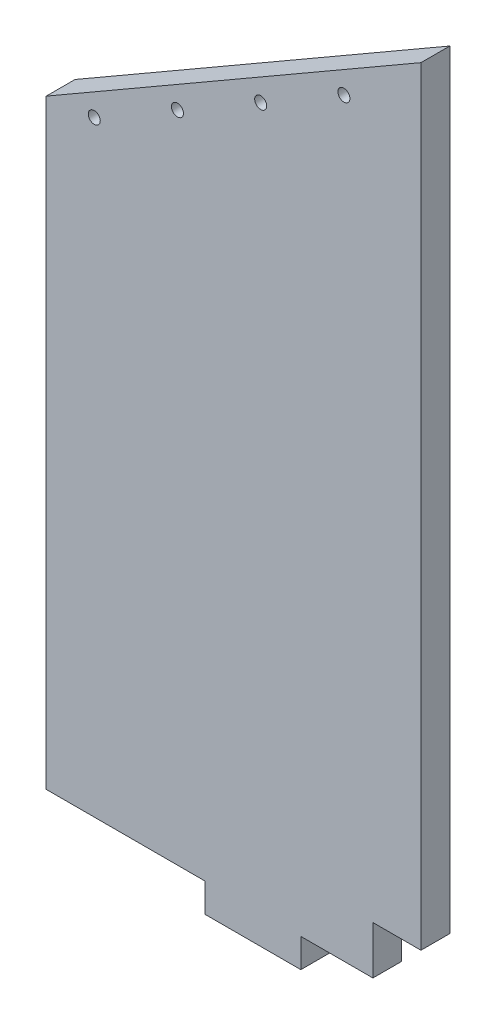
ISO-10303-21;
HEADER;
FILE_DESCRIPTION(('STEP AP214'),'2;1');
FILE_NAME('part.step','',(''),(''),'','','');
FILE_SCHEMA(('AUTOMOTIVE_DESIGN { 1 0 10303 214 1 1 1 1 }'));
ENDSEC;
DATA;
#1=APPLICATION_CONTEXT('core data for automotive mechanical design processes');
#2=APPLICATION_PROTOCOL_DEFINITION('international standard','automotive_design',2000,#1);
#3=PRODUCT_CONTEXT('',#1,'mechanical');
#4=PRODUCT('Part','Part','',(#3));
#5=PRODUCT_RELATED_PRODUCT_CATEGORY('part','',(#4));
#6=PRODUCT_DEFINITION_FORMATION('','',#4);
#7=PRODUCT_DEFINITION_CONTEXT('part definition',#1,'design');
#8=PRODUCT_DEFINITION('design','',#6,#7);
#9=PRODUCT_DEFINITION_SHAPE('','',#8);
#10=(LENGTH_UNIT() NAMED_UNIT(*) SI_UNIT(.MILLI.,.METRE.));
#11=(NAMED_UNIT(*) PLANE_ANGLE_UNIT() SI_UNIT($,.RADIAN.));
#12=(NAMED_UNIT(*) SI_UNIT($,.STERADIAN.) SOLID_ANGLE_UNIT());
#13=UNCERTAINTY_MEASURE_WITH_UNIT(LENGTH_MEASURE(1.E-05),#10,'distance_accuracy_value','');
#14=(GEOMETRIC_REPRESENTATION_CONTEXT(3) GLOBAL_UNCERTAINTY_ASSIGNED_CONTEXT((#13)) GLOBAL_UNIT_ASSIGNED_CONTEXT((#10,
#11,#12)) REPRESENTATION_CONTEXT('',''));
#15=CARTESIAN_POINT('',(0.,0.,0.));
#16=DIRECTION('',(0.,0.,1.));
#17=DIRECTION('',(1.,0.,0.));
#18=AXIS2_PLACEMENT_3D('',#15,#16,#17);
#19=CARTESIAN_POINT('',(0.,0.,6.));
#20=DIRECTION('',(0.,1.,0.));
#21=DIRECTION('',(-1.,0.,0.));
#22=AXIS2_PLACEMENT_3D('',#19,#20,#21);
#23=PLANE('',#22);
#24=DIRECTION('',(0.,0.,1.));
#25=VECTOR('',#24,1.);
#26=CARTESIAN_POINT('',(-25.,0.,0.));
#27=LINE('',#26,#25);
#28=CARTESIAN_POINT('',(-25.,0.,0.));
#29=VERTEX_POINT('',#28);
#30=CARTESIAN_POINT('',(-25.,0.,6.));
#31=VERTEX_POINT('',#30);
#32=EDGE_CURVE('E139',#29,#31,#27,.T.);
#33=ORIENTED_EDGE('',*,*,#32,.F.);
#34=DIRECTION('',(1.,0.,0.));
#35=VECTOR('',#34,1.);
#36=CARTESIAN_POINT('',(0.,0.,0.));
#37=LINE('',#36,#35);
#38=CARTESIAN_POINT('',(-10.,0.,0.));
#39=VERTEX_POINT('',#38);
#40=EDGE_CURVE('E176',#29,#39,#37,.T.);
#41=ORIENTED_EDGE('',*,*,#40,.T.);
#42=DIRECTION('',(0.,0.,1.));
#43=VECTOR('',#42,1.);
#44=CARTESIAN_POINT('',(-10.,0.,-4.));
#45=LINE('',#44,#43);
#46=CARTESIAN_POINT('',(-10.,0.,6.));
#47=VERTEX_POINT('',#46);
#48=EDGE_CURVE('E230',#39,#47,#45,.T.);
#49=ORIENTED_EDGE('',*,*,#48,.T.);
#50=DIRECTION('',(1.,0.,0.));
#51=VECTOR('',#50,1.);
#52=CARTESIAN_POINT('',(0.,0.,6.));
#53=LINE('',#52,#51);
#54=EDGE_CURVE('E53',#31,#47,#53,.T.);
#55=ORIENTED_EDGE('',*,*,#54,.F.);
#56=EDGE_LOOP('',(#33,#41,#49,#55));
#57=FACE_BOUND('',#56,.T.);
#58=ADVANCED_FACE('F36',(#57),#23,.F.);
#59=DIRECTION('',(0.,0.,-1.));
#60=VECTOR('',#59,1.);
#61=CARTESIAN_POINT('',(-45.,0.,0.));
#62=LINE('',#61,#60);
#63=CARTESIAN_POINT('',(-45.,0.,6.));
#64=VERTEX_POINT('',#63);
#65=CARTESIAN_POINT('',(-45.,0.,0.));
#66=VERTEX_POINT('',#65);
#67=EDGE_CURVE('E61',#64,#66,#62,.T.);
#68=ORIENTED_EDGE('',*,*,#67,.F.);
#69=CARTESIAN_POINT('',(-78.,0.,6.));
#70=VERTEX_POINT('',#69);
#71=EDGE_CURVE('E187',#70,#64,#53,.T.);
#72=ORIENTED_EDGE('',*,*,#71,.F.);
#73=DIRECTION('',(0.,0.,-1.));
#74=VECTOR('',#73,1.);
#75=CARTESIAN_POINT('',(-78.,0.,6.));
#76=LINE('',#75,#74);
#77=CARTESIAN_POINT('',(-78.,0.,0.));
#78=VERTEX_POINT('',#77);
#79=EDGE_CURVE('E191',#70,#78,#76,.T.);
#80=ORIENTED_EDGE('',*,*,#79,.T.);
#81=EDGE_CURVE('E179',#78,#66,#37,.T.);
#82=ORIENTED_EDGE('',*,*,#81,.T.);
#83=EDGE_LOOP('',(#68,#72,#80,#82));
#84=FACE_BOUND('',#83,.T.);
#85=ADVANCED_FACE('F259',(#84),#23,.F.);
#86=CARTESIAN_POINT('',(0.,0.,6.));
#87=DIRECTION('',(-1.,0.,0.));
#88=DIRECTION('',(0.,0.,1.));
#89=AXIS2_PLACEMENT_3D('',#86,#87,#88);
#90=PLANE('',#89);
#91=DIRECTION('',(0.,1.,0.));
#92=VECTOR('',#91,1.);
#93=CARTESIAN_POINT('',(0.,0.,6.));
#94=LINE('',#93,#92);
#95=CARTESIAN_POINT('',(0.,10.,6.));
#96=VERTEX_POINT('',#95);
#97=CARTESIAN_POINT('',(0.,170.,6.));
#98=VERTEX_POINT('',#97);
#99=EDGE_CURVE('E182',#96,#98,#94,.T.);
#100=ORIENTED_EDGE('',*,*,#99,.F.);
#101=DIRECTION('',(0.,0.,1.));
#102=VECTOR('',#101,1.);
#103=CARTESIAN_POINT('',(0.,10.,-4.));
#104=LINE('',#103,#102);
#105=CARTESIAN_POINT('',(0.,10.,0.));
#106=VERTEX_POINT('',#105);
#107=EDGE_CURVE('E223',#106,#96,#104,.T.);
#108=ORIENTED_EDGE('',*,*,#107,.F.);
#109=DIRECTION('',(0.,1.,0.));
#110=VECTOR('',#109,1.);
#111=CARTESIAN_POINT('',(0.,0.,0.));
#112=LINE('',#111,#110);
#113=CARTESIAN_POINT('',(0.,170.,0.));
#114=VERTEX_POINT('',#113);
#115=EDGE_CURVE('E204',#106,#114,#112,.T.);
#116=ORIENTED_EDGE('',*,*,#115,.T.);
#117=DIRECTION('',(0.,0.,-1.));
#118=VECTOR('',#117,1.);
#119=CARTESIAN_POINT('',(0.,170.,6.));
#120=LINE('',#119,#118);
#121=EDGE_CURVE('E198',#98,#114,#120,.T.);
#122=ORIENTED_EDGE('',*,*,#121,.F.);
#123=EDGE_LOOP('',(#100,#108,#116,#122));
#124=FACE_BOUND('',#123,.T.);
#125=ADVANCED_FACE('F38',(#124),#90,.F.);
#126=CARTESIAN_POINT('',(-78.,124.966679003209,6.));
#127=DIRECTION('',(0.499999999999998,-0.86602540378444,0.));
#128=DIRECTION('',(0.86602540378444,0.499999999999998,0.));
#129=AXIS2_PLACEMENT_3D('',#126,#127,#128);
#130=PLANE('',#129);
#131=DIRECTION('',(-0.86602540378444,-0.499999999999998,0.));
#132=VECTOR('',#131,1.);
#133=CARTESIAN_POINT('',(-78.,124.966679003209,0.));
#134=LINE('',#133,#132);
#135=CARTESIAN_POINT('',(-78.,124.966679003209,0.));
#136=VERTEX_POINT('',#135);
#137=EDGE_CURVE('E184',#114,#136,#134,.T.);
#138=ORIENTED_EDGE('',*,*,#137,.T.);
#139=DIRECTION('',(0.,0.,-1.));
#140=VECTOR('',#139,1.);
#141=CARTESIAN_POINT('',(-78.,124.966679003209,6.));
#142=LINE('',#141,#140);
#143=CARTESIAN_POINT('',(-78.,124.966679003209,6.));
#144=VERTEX_POINT('',#143);
#145=EDGE_CURVE('E195',#144,#136,#142,.T.);
#146=ORIENTED_EDGE('',*,*,#145,.F.);
#147=DIRECTION('',(-0.86602540378444,-0.499999999999998,0.));
#148=VECTOR('',#147,1.);
#149=CARTESIAN_POINT('',(-78.,124.966679003209,6.));
#150=LINE('',#149,#148);
#151=EDGE_CURVE('E244',#98,#144,#150,.T.);
#152=ORIENTED_EDGE('',*,*,#151,.F.);
#153=ORIENTED_EDGE('',*,*,#121,.T.);
#154=EDGE_LOOP('',(#138,#146,#152,#153));
#155=FACE_BOUND('',#154,.T.);
#156=ADVANCED_FACE('F252',(#155),#130,.F.);
#157=CARTESIAN_POINT('',(-78.,0.,6.));
#158=DIRECTION('',(1.,0.,0.));
#159=DIRECTION('',(0.,0.,-1.));
#160=AXIS2_PLACEMENT_3D('',#157,#158,#159);
#161=PLANE('',#160);
#162=DIRECTION('',(0.,-1.,0.));
#163=VECTOR('',#162,1.);
#164=CARTESIAN_POINT('',(-78.,0.,0.));
#165=LINE('',#164,#163);
#166=EDGE_CURVE('E180',#136,#78,#165,.T.);
#167=ORIENTED_EDGE('',*,*,#166,.T.);
#168=ORIENTED_EDGE('',*,*,#79,.F.);
#169=DIRECTION('',(0.,-1.,0.));
#170=VECTOR('',#169,1.);
#171=CARTESIAN_POINT('',(-78.,0.,6.));
#172=LINE('',#171,#170);
#173=EDGE_CURVE('E246',#144,#70,#172,.T.);
#174=ORIENTED_EDGE('',*,*,#173,.F.);
#175=ORIENTED_EDGE('',*,*,#145,.T.);
#176=EDGE_LOOP('',(#167,#168,#174,#175));
#177=FACE_BOUND('',#176,.T.);
#178=ADVANCED_FACE('F257',(#177),#161,.F.);
#179=CARTESIAN_POINT('',(0.,0.,6.));
#180=DIRECTION('',(0.,0.,1.));
#181=DIRECTION('',(1.,0.,0.));
#182=AXIS2_PLACEMENT_3D('',#179,#180,#181);
#183=PLANE('',#182);
#184=DIRECTION('',(0.,-1.,0.));
#185=VECTOR('',#184,1.);
#186=CARTESIAN_POINT('',(-10.,0.,6.));
#187=LINE('',#186,#185);
#188=CARTESIAN_POINT('',(-10.,10.,6.));
#189=VERTEX_POINT('',#188);
#190=EDGE_CURVE('E143',#189,#47,#187,.T.);
#191=ORIENTED_EDGE('',*,*,#190,.F.);
#192=DIRECTION('',(-1.,0.,0.));
#193=VECTOR('',#192,1.);
#194=CARTESIAN_POINT('',(0.,10.,6.));
#195=LINE('',#194,#193);
#196=EDGE_CURVE('E140',#96,#189,#195,.T.);
#197=ORIENTED_EDGE('',*,*,#196,.F.);
#198=ORIENTED_EDGE('',*,*,#99,.T.);
#199=ORIENTED_EDGE('',*,*,#151,.T.);
#200=ORIENTED_EDGE('',*,*,#173,.T.);
#201=ORIENTED_EDGE('',*,*,#71,.T.);
#202=DIRECTION('',(0.,1.,0.));
#203=VECTOR('',#202,1.);
#204=CARTESIAN_POINT('',(-45.,-6.00000000000001,6.));
#205=LINE('',#204,#203);
#206=CARTESIAN_POINT('',(-45.,-6.00000000000001,6.));
#207=VERTEX_POINT('',#206);
#208=EDGE_CURVE('E124',#207,#64,#205,.T.);
#209=ORIENTED_EDGE('',*,*,#208,.F.);
#210=DIRECTION('',(-1.,0.,0.));
#211=VECTOR('',#210,1.);
#212=CARTESIAN_POINT('',(-25.,-6.,6.));
#213=LINE('',#212,#211);
#214=CARTESIAN_POINT('',(-25.,-6.,6.));
#215=VERTEX_POINT('',#214);
#216=EDGE_CURVE('E115',#215,#207,#213,.T.);
#217=ORIENTED_EDGE('',*,*,#216,.F.);
#218=DIRECTION('',(0.,1.,0.));
#219=VECTOR('',#218,1.);
#220=CARTESIAN_POINT('',(-25.,-6.,6.));
#221=LINE('',#220,#219);
#222=EDGE_CURVE('E121',#215,#31,#221,.T.);
#223=ORIENTED_EDGE('',*,*,#222,.T.);
#224=ORIENTED_EDGE('',*,*,#54,.T.);
#225=EDGE_LOOP('',(#191,#197,#198,#199,#200,#201,#209,#217,#223,#224));
#226=FACE_BOUND('',#225,.T.);
#227=CARTESIAN_POINT('',(-33.3589838486225,146.121379541588,6.));
#228=DIRECTION('',(0.,0.,1.));
#229=DIRECTION('',(1.,0.,0.));
#230=AXIS2_PLACEMENT_3D('',#227,#228,#229);
#231=CIRCLE('',#230,1.25);
#232=CARTESIAN_POINT('',(-32.1089838486225,146.121379541588,6.));
#233=VERTEX_POINT('',#232);
#234=EDGE_CURVE('E217',#233,#233,#231,.T.);
#235=ORIENTED_EDGE('',*,*,#234,.F.);
#236=EDGE_LOOP('',(#235));
#237=FACE_BOUND('',#236,.T.);
#238=CARTESIAN_POINT('',(-16.0384757729337,156.121379541588,6.));
#239=DIRECTION('',(0.,0.,1.));
#240=DIRECTION('',(1.,0.,0.));
#241=AXIS2_PLACEMENT_3D('',#238,#239,#240);
#242=CIRCLE('',#241,1.25);
#243=CARTESIAN_POINT('',(-14.7884757729337,156.121379541588,6.));
#244=VERTEX_POINT('',#243);
#245=EDGE_CURVE('E213',#244,#244,#242,.T.);
#246=ORIENTED_EDGE('',*,*,#245,.F.);
#247=EDGE_LOOP('',(#246));
#248=FACE_BOUND('',#247,.T.);
#249=CARTESIAN_POINT('',(-50.6794919243112,136.121379541588,6.));
#250=DIRECTION('',(0.,0.,1.));
#251=DIRECTION('',(1.,0.,0.));
#252=AXIS2_PLACEMENT_3D('',#249,#250,#251);
#253=CIRCLE('',#252,1.25);
#254=CARTESIAN_POINT('',(-49.4294919243112,136.121379541588,6.));
#255=VERTEX_POINT('',#254);
#256=EDGE_CURVE('E209',#255,#255,#253,.T.);
#257=ORIENTED_EDGE('',*,*,#256,.F.);
#258=EDGE_LOOP('',(#257));
#259=FACE_BOUND('',#258,.T.);
#260=CARTESIAN_POINT('',(-68.,126.121379541588,6.));
#261=DIRECTION('',(0.,0.,1.));
#262=DIRECTION('',(1.,0.,0.));
#263=AXIS2_PLACEMENT_3D('',#260,#261,#262);
#264=CIRCLE('',#263,1.25);
#265=CARTESIAN_POINT('',(-66.75,126.121379541588,6.));
#266=VERTEX_POINT('',#265);
#267=EDGE_CURVE('E205',#266,#266,#264,.T.);
#268=ORIENTED_EDGE('',*,*,#267,.F.);
#269=EDGE_LOOP('',(#268));
#270=FACE_BOUND('',#269,.T.);
#271=ADVANCED_FACE('F118',(#226,#237,#248,#259,#270),#183,.T.);
#272=CARTESIAN_POINT('',(0.,0.,0.));
#273=DIRECTION('',(0.,0.,1.));
#274=DIRECTION('',(1.,0.,0.));
#275=AXIS2_PLACEMENT_3D('',#272,#273,#274);
#276=PLANE('',#275);
#277=CARTESIAN_POINT('',(-33.3589838486225,146.121379541588,0.));
#278=DIRECTION('',(0.,0.,1.));
#279=DIRECTION('',(1.,0.,0.));
#280=AXIS2_PLACEMENT_3D('',#277,#278,#279);
#281=CIRCLE('',#280,1.25);
#282=CARTESIAN_POINT('',(-32.1089838486225,146.121379541588,0.));
#283=VERTEX_POINT('',#282);
#284=EDGE_CURVE('E214',#283,#283,#281,.T.);
#285=ORIENTED_EDGE('',*,*,#284,.T.);
#286=EDGE_LOOP('',(#285));
#287=FACE_BOUND('',#286,.T.);
#288=CARTESIAN_POINT('',(-16.0384757729337,156.121379541588,0.));
#289=DIRECTION('',(0.,0.,1.));
#290=DIRECTION('',(1.,0.,0.));
#291=AXIS2_PLACEMENT_3D('',#288,#289,#290);
#292=CIRCLE('',#291,1.25);
#293=CARTESIAN_POINT('',(-14.7884757729337,156.121379541588,0.));
#294=VERTEX_POINT('',#293);
#295=EDGE_CURVE('E210',#294,#294,#292,.T.);
#296=ORIENTED_EDGE('',*,*,#295,.T.);
#297=EDGE_LOOP('',(#296));
#298=FACE_BOUND('',#297,.T.);
#299=CARTESIAN_POINT('',(-50.6794919243112,136.121379541588,0.));
#300=DIRECTION('',(0.,0.,1.));
#301=DIRECTION('',(1.,0.,0.));
#302=AXIS2_PLACEMENT_3D('',#299,#300,#301);
#303=CIRCLE('',#302,1.25);
#304=CARTESIAN_POINT('',(-49.4294919243112,136.121379541588,0.));
#305=VERTEX_POINT('',#304);
#306=EDGE_CURVE('E206',#305,#305,#303,.T.);
#307=ORIENTED_EDGE('',*,*,#306,.T.);
#308=EDGE_LOOP('',(#307));
#309=FACE_BOUND('',#308,.T.);
#310=CARTESIAN_POINT('',(-68.,126.121379541588,0.));
#311=DIRECTION('',(0.,0.,1.));
#312=DIRECTION('',(1.,0.,0.));
#313=AXIS2_PLACEMENT_3D('',#310,#311,#312);
#314=CIRCLE('',#313,1.25);
#315=CARTESIAN_POINT('',(-66.75,126.121379541588,0.));
#316=VERTEX_POINT('',#315);
#317=EDGE_CURVE('E201',#316,#316,#314,.T.);
#318=ORIENTED_EDGE('',*,*,#317,.T.);
#319=EDGE_LOOP('',(#318));
#320=FACE_BOUND('',#319,.T.);
#321=DIRECTION('',(-1.,0.,0.));
#322=VECTOR('',#321,1.);
#323=CARTESIAN_POINT('',(0.,10.,0.));
#324=LINE('',#323,#322);
#325=CARTESIAN_POINT('',(-10.,10.,0.));
#326=VERTEX_POINT('',#325);
#327=EDGE_CURVE('E45',#106,#326,#324,.T.);
#328=ORIENTED_EDGE('',*,*,#327,.T.);
#329=DIRECTION('',(0.,-1.,0.));
#330=VECTOR('',#329,1.);
#331=CARTESIAN_POINT('',(-10.,0.,0.));
#332=LINE('',#331,#330);
#333=EDGE_CURVE('E12',#326,#39,#332,.T.);
#334=ORIENTED_EDGE('',*,*,#333,.T.);
#335=ORIENTED_EDGE('',*,*,#40,.F.);
#336=DIRECTION('',(0.,1.,0.));
#337=VECTOR('',#336,1.);
#338=CARTESIAN_POINT('',(-25.,-6.,0.));
#339=LINE('',#338,#337);
#340=CARTESIAN_POINT('',(-25.,-6.,0.));
#341=VERTEX_POINT('',#340);
#342=EDGE_CURVE('E153',#341,#29,#339,.T.);
#343=ORIENTED_EDGE('',*,*,#342,.F.);
#344=DIRECTION('',(1.,0.,0.));
#345=VECTOR('',#344,1.);
#346=CARTESIAN_POINT('',(-25.,-6.,0.));
#347=LINE('',#346,#345);
#348=CARTESIAN_POINT('',(-45.,-6.00000000000001,0.));
#349=VERTEX_POINT('',#348);
#350=EDGE_CURVE('E133',#349,#341,#347,.T.);
#351=ORIENTED_EDGE('',*,*,#350,.F.);
#352=DIRECTION('',(0.,1.,0.));
#353=VECTOR('',#352,1.);
#354=CARTESIAN_POINT('',(-45.,-6.00000000000001,0.));
#355=LINE('',#354,#353);
#356=EDGE_CURVE('E145',#349,#66,#355,.T.);
#357=ORIENTED_EDGE('',*,*,#356,.T.);
#358=ORIENTED_EDGE('',*,*,#81,.F.);
#359=ORIENTED_EDGE('',*,*,#166,.F.);
#360=ORIENTED_EDGE('',*,*,#137,.F.);
#361=ORIENTED_EDGE('',*,*,#115,.F.);
#362=EDGE_LOOP('',(#328,#334,#335,#343,#351,#357,#358,#359,#360,#361));
#363=FACE_BOUND('',#362,.T.);
#364=ADVANCED_FACE('F174',(#287,#298,#309,#320,#363),#276,.F.);
#365=CARTESIAN_POINT('',(-68.,126.121379541588,-4.));
#366=DIRECTION('',(0.,0.,1.));
#367=DIRECTION('',(1.,0.,0.));
#368=AXIS2_PLACEMENT_3D('',#365,#366,#367);
#369=CYLINDRICAL_SURFACE('',#368,1.25);
#370=ORIENTED_EDGE('',*,*,#267,.T.);
#371=EDGE_LOOP('',(#370));
#372=FACE_BOUND('',#371,.T.);
#373=ORIENTED_EDGE('',*,*,#317,.F.);
#374=EDGE_LOOP('',(#373));
#375=FACE_BOUND('',#374,.T.);
#376=ADVANCED_FACE('F304',(#372,#375),#369,.F.);
#377=CARTESIAN_POINT('',(-50.6794919243112,136.121379541588,-4.));
#378=DIRECTION('',(0.,0.,1.));
#379=DIRECTION('',(1.,0.,0.));
#380=AXIS2_PLACEMENT_3D('',#377,#378,#379);
#381=CYLINDRICAL_SURFACE('',#380,1.25);
#382=ORIENTED_EDGE('',*,*,#256,.T.);
#383=EDGE_LOOP('',(#382));
#384=FACE_BOUND('',#383,.T.);
#385=ORIENTED_EDGE('',*,*,#306,.F.);
#386=EDGE_LOOP('',(#385));
#387=FACE_BOUND('',#386,.T.);
#388=ADVANCED_FACE('F346',(#384,#387),#381,.F.);
#389=CARTESIAN_POINT('',(-16.0384757729337,156.121379541588,-4.));
#390=DIRECTION('',(0.,0.,1.));
#391=DIRECTION('',(1.,0.,0.));
#392=AXIS2_PLACEMENT_3D('',#389,#390,#391);
#393=CYLINDRICAL_SURFACE('',#392,1.25);
#394=ORIENTED_EDGE('',*,*,#245,.T.);
#395=EDGE_LOOP('',(#394));
#396=FACE_BOUND('',#395,.T.);
#397=ORIENTED_EDGE('',*,*,#295,.F.);
#398=EDGE_LOOP('',(#397));
#399=FACE_BOUND('',#398,.T.);
#400=ADVANCED_FACE('F342',(#396,#399),#393,.F.);
#401=CARTESIAN_POINT('',(-33.3589838486225,146.121379541588,-4.));
#402=DIRECTION('',(0.,0.,1.));
#403=DIRECTION('',(1.,0.,0.));
#404=AXIS2_PLACEMENT_3D('',#401,#402,#403);
#405=CYLINDRICAL_SURFACE('',#404,1.25);
#406=ORIENTED_EDGE('',*,*,#234,.T.);
#407=EDGE_LOOP('',(#406));
#408=FACE_BOUND('',#407,.T.);
#409=ORIENTED_EDGE('',*,*,#284,.F.);
#410=EDGE_LOOP('',(#409));
#411=FACE_BOUND('',#410,.T.);
#412=ADVANCED_FACE('F338',(#408,#411),#405,.F.);
#413=CARTESIAN_POINT('',(-10.,0.,-4.));
#414=DIRECTION('',(-1.,0.,0.));
#415=DIRECTION('',(0.,0.,1.));
#416=AXIS2_PLACEMENT_3D('',#413,#414,#415);
#417=PLANE('',#416);
#418=DIRECTION('',(0.,0.,1.));
#419=VECTOR('',#418,1.);
#420=CARTESIAN_POINT('',(-10.,10.,-4.));
#421=LINE('',#420,#419);
#422=EDGE_CURVE('E225',#326,#189,#421,.T.);
#423=ORIENTED_EDGE('',*,*,#422,.T.);
#424=ORIENTED_EDGE('',*,*,#190,.T.);
#425=ORIENTED_EDGE('',*,*,#48,.F.);
#426=ORIENTED_EDGE('',*,*,#333,.F.);
#427=EDGE_LOOP('',(#423,#424,#425,#426));
#428=FACE_BOUND('',#427,.T.);
#429=ADVANCED_FACE('F261',(#428),#417,.F.);
#430=CARTESIAN_POINT('',(0.,10.,-4.));
#431=DIRECTION('',(0.,1.,0.));
#432=DIRECTION('',(-1.,0.,0.));
#433=AXIS2_PLACEMENT_3D('',#430,#431,#432);
#434=PLANE('',#433);
#435=ORIENTED_EDGE('',*,*,#107,.T.);
#436=ORIENTED_EDGE('',*,*,#196,.T.);
#437=ORIENTED_EDGE('',*,*,#422,.F.);
#438=ORIENTED_EDGE('',*,*,#327,.F.);
#439=EDGE_LOOP('',(#435,#436,#437,#438));
#440=FACE_BOUND('',#439,.T.);
#441=ADVANCED_FACE('F222',(#440),#434,.F.);
#442=CARTESIAN_POINT('',(-25.,-6.,0.));
#443=DIRECTION('',(-1.,0.,0.));
#444=DIRECTION('',(0.,-1.,0.));
#445=AXIS2_PLACEMENT_3D('',#442,#443,#444);
#446=PLANE('',#445);
#447=ORIENTED_EDGE('',*,*,#32,.T.);
#448=ORIENTED_EDGE('',*,*,#222,.F.);
#449=DIRECTION('',(0.,0.,1.));
#450=VECTOR('',#449,1.);
#451=CARTESIAN_POINT('',(-25.,-6.,0.));
#452=LINE('',#451,#450);
#453=EDGE_CURVE('E128',#341,#215,#452,.T.);
#454=ORIENTED_EDGE('',*,*,#453,.F.);
#455=ORIENTED_EDGE('',*,*,#342,.T.);
#456=EDGE_LOOP('',(#447,#448,#454,#455));
#457=FACE_BOUND('',#456,.T.);
#458=ADVANCED_FACE('F138',(#457),#446,.F.);
#459=CARTESIAN_POINT('',(-45.,-6.00000000000001,0.));
#460=DIRECTION('',(1.,0.,0.));
#461=DIRECTION('',(0.,1.,0.));
#462=AXIS2_PLACEMENT_3D('',#459,#460,#461);
#463=PLANE('',#462);
#464=ORIENTED_EDGE('',*,*,#67,.T.);
#465=ORIENTED_EDGE('',*,*,#356,.F.);
#466=DIRECTION('',(0.,0.,-1.));
#467=VECTOR('',#466,1.);
#468=CARTESIAN_POINT('',(-45.,-6.00000000000001,0.));
#469=LINE('',#468,#467);
#470=EDGE_CURVE('E127',#207,#349,#469,.T.);
#471=ORIENTED_EDGE('',*,*,#470,.F.);
#472=ORIENTED_EDGE('',*,*,#208,.T.);
#473=EDGE_LOOP('',(#464,#465,#471,#472));
#474=FACE_BOUND('',#473,.T.);
#475=ADVANCED_FACE('F172',(#474),#463,.F.);
#476=CARTESIAN_POINT('',(0.,-6.,0.));
#477=DIRECTION('',(0.,-1.,0.));
#478=DIRECTION('',(1.,0.,0.));
#479=AXIS2_PLACEMENT_3D('',#476,#477,#478);
#480=PLANE('',#479);
#481=ORIENTED_EDGE('',*,*,#453,.T.);
#482=ORIENTED_EDGE('',*,*,#216,.T.);
#483=ORIENTED_EDGE('',*,*,#470,.T.);
#484=ORIENTED_EDGE('',*,*,#350,.T.);
#485=EDGE_LOOP('',(#481,#482,#483,#484));
#486=FACE_BOUND('',#485,.T.);
#487=ADVANCED_FACE('F131',(#486),#480,.T.);
#488=CLOSED_SHELL('',(#58,#85,#125,#156,#178,#271,#364,#376,#388,#400,#412,#429,#441,#458,#475,#487));
#489=MANIFOLD_SOLID_BREP('B2',#488);
#490=ADVANCED_BREP_SHAPE_REPRESENTATION('',(#18,#489),#14);
#491=SHAPE_DEFINITION_REPRESENTATION(#9,#490);
ENDSEC;
END-ISO-10303-21;
